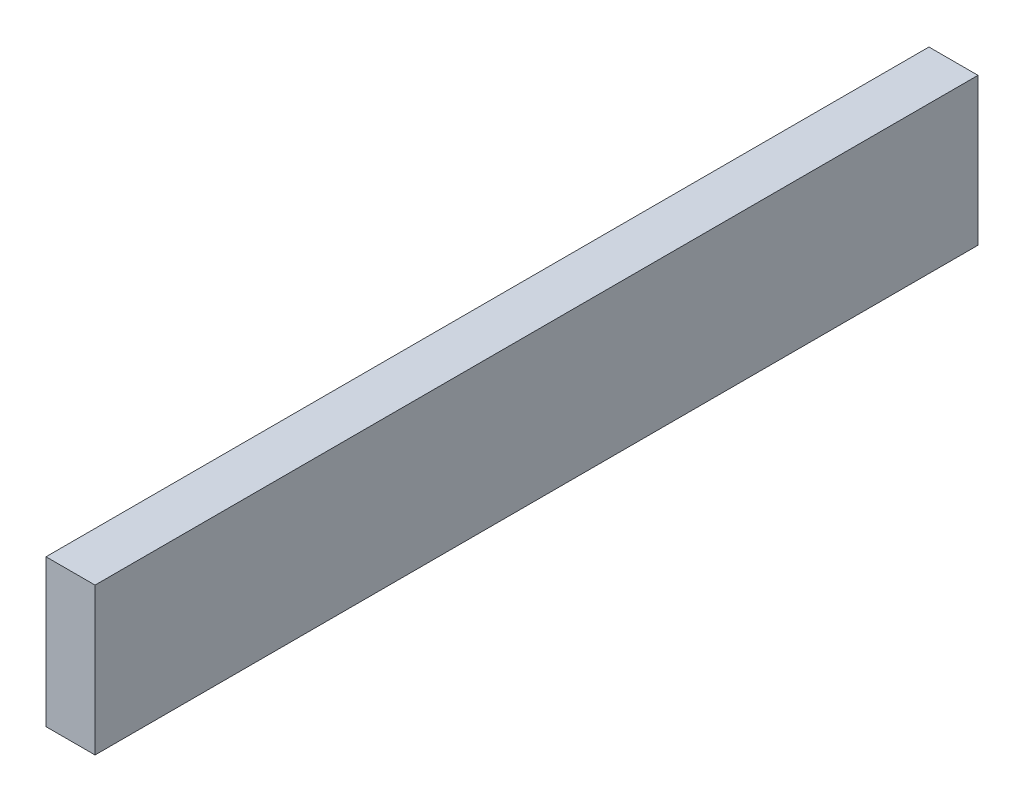
ISO-10303-21;
HEADER;
FILE_DESCRIPTION(('STEP AP214'),'2;1');
FILE_NAME('part.step','',(''),(''),'','','');
FILE_SCHEMA(('AUTOMOTIVE_DESIGN { 1 0 10303 214 1 1 1 1 }'));
ENDSEC;
DATA;
#1=APPLICATION_CONTEXT('core data for automotive mechanical design processes');
#2=APPLICATION_PROTOCOL_DEFINITION('international standard','automotive_design',2000,#1);
#3=PRODUCT_CONTEXT('',#1,'mechanical');
#4=PRODUCT('Part','Part','',(#3));
#5=PRODUCT_RELATED_PRODUCT_CATEGORY('part','',(#4));
#6=PRODUCT_DEFINITION_FORMATION('','',#4);
#7=PRODUCT_DEFINITION_CONTEXT('part definition',#1,'design');
#8=PRODUCT_DEFINITION('design','',#6,#7);
#9=PRODUCT_DEFINITION_SHAPE('','',#8);
#10=(LENGTH_UNIT() NAMED_UNIT(*) SI_UNIT(.MILLI.,.METRE.));
#11=(NAMED_UNIT(*) PLANE_ANGLE_UNIT() SI_UNIT($,.RADIAN.));
#12=(NAMED_UNIT(*) SI_UNIT($,.STERADIAN.) SOLID_ANGLE_UNIT());
#13=UNCERTAINTY_MEASURE_WITH_UNIT(LENGTH_MEASURE(1.E-05),#10,'distance_accuracy_value','');
#14=(GEOMETRIC_REPRESENTATION_CONTEXT(3) GLOBAL_UNCERTAINTY_ASSIGNED_CONTEXT((#13)) GLOBAL_UNIT_ASSIGNED_CONTEXT((#10,
#11,#12)) REPRESENTATION_CONTEXT('',''));
#15=CARTESIAN_POINT('',(0.,0.,0.));
#16=DIRECTION('',(0.,0.,1.));
#17=DIRECTION('',(1.,0.,0.));
#18=AXIS2_PLACEMENT_3D('',#15,#16,#17);
#19=CARTESIAN_POINT('',(25.4,76.2,-914.4));
#20=DIRECTION('',(1.,0.,0.));
#21=DIRECTION('',(0.,0.,-1.));
#22=AXIS2_PLACEMENT_3D('',#19,#20,#21);
#23=PLANE('',#22);
#24=DIRECTION('',(0.,1.,0.));
#25=VECTOR('',#24,1.);
#26=CARTESIAN_POINT('',(25.4,76.2,0.));
#27=LINE('',#26,#25);
#28=CARTESIAN_POINT('',(25.4,-76.2,0.));
#29=VERTEX_POINT('',#28);
#30=CARTESIAN_POINT('',(25.4,76.2,0.));
#31=VERTEX_POINT('',#30);
#32=EDGE_CURVE('E97',#29,#31,#27,.T.);
#33=ORIENTED_EDGE('',*,*,#32,.F.);
#34=DIRECTION('',(0.,0.,1.));
#35=VECTOR('',#34,1.);
#36=CARTESIAN_POINT('',(25.4,-76.2,-914.4));
#37=LINE('',#36,#35);
#38=CARTESIAN_POINT('',(25.4,-76.2,-914.4));
#39=VERTEX_POINT('',#38);
#40=EDGE_CURVE('E11',#39,#29,#37,.T.);
#41=ORIENTED_EDGE('',*,*,#40,.F.);
#42=DIRECTION('',(0.,1.,0.));
#43=VECTOR('',#42,1.);
#44=CARTESIAN_POINT('',(25.4,76.2,-914.4));
#45=LINE('',#44,#43);
#46=CARTESIAN_POINT('',(25.4,76.2,-914.4));
#47=VERTEX_POINT('',#46);
#48=EDGE_CURVE('E91',#39,#47,#45,.T.);
#49=ORIENTED_EDGE('',*,*,#48,.T.);
#50=DIRECTION('',(0.,0.,1.));
#51=VECTOR('',#50,1.);
#52=CARTESIAN_POINT('',(25.4,76.2,-914.4));
#53=LINE('',#52,#51);
#54=EDGE_CURVE('E36',#47,#31,#53,.T.);
#55=ORIENTED_EDGE('',*,*,#54,.T.);
#56=EDGE_LOOP('',(#33,#41,#49,#55));
#57=FACE_BOUND('',#56,.T.);
#58=ADVANCED_FACE('F33',(#57),#23,.T.);
#59=CARTESIAN_POINT('',(-25.4,-76.2,-914.4));
#60=DIRECTION('',(0.,-1.,0.));
#61=DIRECTION('',(0.,0.,-1.));
#62=AXIS2_PLACEMENT_3D('',#59,#60,#61);
#63=PLANE('',#62);
#64=DIRECTION('',(1.,0.,0.));
#65=VECTOR('',#64,1.);
#66=CARTESIAN_POINT('',(-25.4,-76.2,0.));
#67=LINE('',#66,#65);
#68=CARTESIAN_POINT('',(-25.4,-76.2,0.));
#69=VERTEX_POINT('',#68);
#70=EDGE_CURVE('E93',#69,#29,#67,.T.);
#71=ORIENTED_EDGE('',*,*,#70,.F.);
#72=DIRECTION('',(0.,0.,1.));
#73=VECTOR('',#72,1.);
#74=CARTESIAN_POINT('',(-25.4,-76.2,-914.4));
#75=LINE('',#74,#73);
#76=CARTESIAN_POINT('',(-25.4,-76.2,-914.4));
#77=VERTEX_POINT('',#76);
#78=EDGE_CURVE('E42',#77,#69,#75,.T.);
#79=ORIENTED_EDGE('',*,*,#78,.F.);
#80=DIRECTION('',(1.,0.,0.));
#81=VECTOR('',#80,1.);
#82=CARTESIAN_POINT('',(-25.4,-76.2,-914.4));
#83=LINE('',#82,#81);
#84=EDGE_CURVE('E88',#77,#39,#83,.T.);
#85=ORIENTED_EDGE('',*,*,#84,.T.);
#86=ORIENTED_EDGE('',*,*,#40,.T.);
#87=EDGE_LOOP('',(#71,#79,#85,#86));
#88=FACE_BOUND('',#87,.T.);
#89=ADVANCED_FACE('F107',(#88),#63,.T.);
#90=CARTESIAN_POINT('',(-25.4,76.2,-914.4));
#91=DIRECTION('',(-1.,0.,0.));
#92=DIRECTION('',(0.,0.,1.));
#93=AXIS2_PLACEMENT_3D('',#90,#91,#92);
#94=PLANE('',#93);
#95=DIRECTION('',(0.,-1.,0.));
#96=VECTOR('',#95,1.);
#97=CARTESIAN_POINT('',(-25.4,76.2,0.));
#98=LINE('',#97,#96);
#99=CARTESIAN_POINT('',(-25.4,76.2,0.));
#100=VERTEX_POINT('',#99);
#101=EDGE_CURVE('E83',#100,#69,#98,.T.);
#102=ORIENTED_EDGE('',*,*,#101,.F.);
#103=DIRECTION('',(0.,0.,1.));
#104=VECTOR('',#103,1.);
#105=CARTESIAN_POINT('',(-25.4,76.2,-914.4));
#106=LINE('',#105,#104);
#107=CARTESIAN_POINT('',(-25.4,76.2,-914.4));
#108=VERTEX_POINT('',#107);
#109=EDGE_CURVE('E78',#108,#100,#106,.T.);
#110=ORIENTED_EDGE('',*,*,#109,.F.);
#111=DIRECTION('',(0.,-1.,0.));
#112=VECTOR('',#111,1.);
#113=CARTESIAN_POINT('',(-25.4,76.2,-914.4));
#114=LINE('',#113,#112);
#115=EDGE_CURVE('E81',#108,#77,#114,.T.);
#116=ORIENTED_EDGE('',*,*,#115,.T.);
#117=ORIENTED_EDGE('',*,*,#78,.T.);
#118=EDGE_LOOP('',(#102,#110,#116,#117));
#119=FACE_BOUND('',#118,.T.);
#120=ADVANCED_FACE('F80',(#119),#94,.T.);
#121=CARTESIAN_POINT('',(-25.4,76.2,-914.4));
#122=DIRECTION('',(0.,1.,0.));
#123=DIRECTION('',(-1.,0.,0.));
#124=AXIS2_PLACEMENT_3D('',#121,#122,#123);
#125=PLANE('',#124);
#126=DIRECTION('',(-1.,0.,0.));
#127=VECTOR('',#126,1.);
#128=CARTESIAN_POINT('',(-25.4,76.2,0.));
#129=LINE('',#128,#127);
#130=EDGE_CURVE('E100',#31,#100,#129,.T.);
#131=ORIENTED_EDGE('',*,*,#130,.F.);
#132=ORIENTED_EDGE('',*,*,#54,.F.);
#133=DIRECTION('',(-1.,0.,0.));
#134=VECTOR('',#133,1.);
#135=CARTESIAN_POINT('',(-25.4,76.2,-914.4));
#136=LINE('',#135,#134);
#137=EDGE_CURVE('E87',#47,#108,#136,.T.);
#138=ORIENTED_EDGE('',*,*,#137,.T.);
#139=ORIENTED_EDGE('',*,*,#109,.T.);
#140=EDGE_LOOP('',(#131,#132,#138,#139));
#141=FACE_BOUND('',#140,.T.);
#142=ADVANCED_FACE('F90',(#141),#125,.T.);
#143=CARTESIAN_POINT('',(0.,0.,-914.4));
#144=DIRECTION('',(0.,0.,1.));
#145=DIRECTION('',(1.,0.,0.));
#146=AXIS2_PLACEMENT_3D('',#143,#144,#145);
#147=PLANE('',#146);
#148=ORIENTED_EDGE('',*,*,#48,.F.);
#149=ORIENTED_EDGE('',*,*,#84,.F.);
#150=ORIENTED_EDGE('',*,*,#115,.F.);
#151=ORIENTED_EDGE('',*,*,#137,.F.);
#152=EDGE_LOOP('',(#148,#149,#150,#151));
#153=FACE_BOUND('',#152,.T.);
#154=ADVANCED_FACE('F86',(#153),#147,.F.);
#155=CARTESIAN_POINT('',(0.,0.,0.));
#156=DIRECTION('',(0.,0.,1.));
#157=DIRECTION('',(1.,0.,0.));
#158=AXIS2_PLACEMENT_3D('',#155,#156,#157);
#159=PLANE('',#158);
#160=ORIENTED_EDGE('',*,*,#32,.T.);
#161=ORIENTED_EDGE('',*,*,#130,.T.);
#162=ORIENTED_EDGE('',*,*,#101,.T.);
#163=ORIENTED_EDGE('',*,*,#70,.T.);
#164=EDGE_LOOP('',(#160,#161,#162,#163));
#165=FACE_BOUND('',#164,.T.);
#166=ADVANCED_FACE('F106',(#165),#159,.T.);
#167=CLOSED_SHELL('',(#58,#89,#120,#142,#154,#166));
#168=MANIFOLD_SOLID_BREP('B2',#167);
#169=ADVANCED_BREP_SHAPE_REPRESENTATION('',(#18,#168),#14);
#170=SHAPE_DEFINITION_REPRESENTATION(#9,#169);
ENDSEC;
END-ISO-10303-21;
